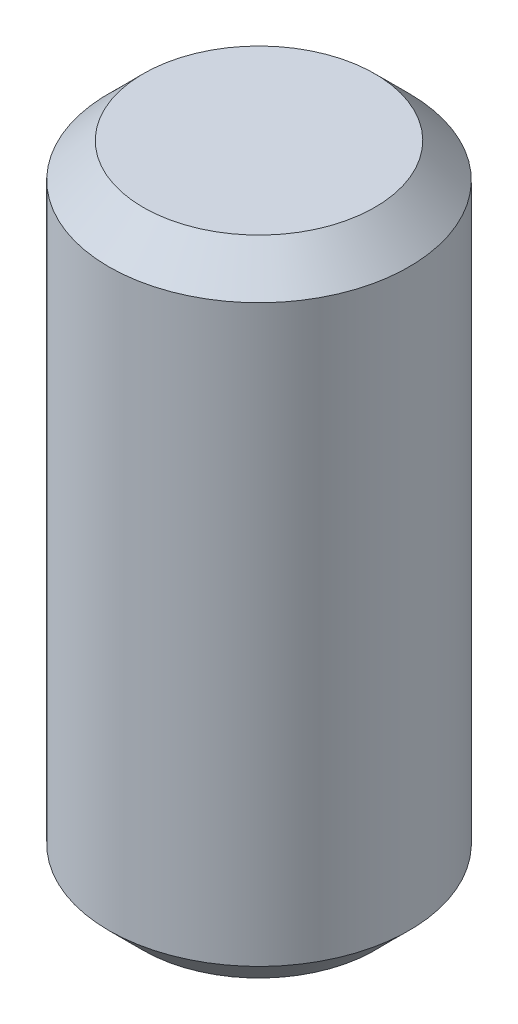
ISO-10303-21;
HEADER;
FILE_DESCRIPTION(('STEP AP214'),'2;1');
FILE_NAME('part.step','',(''),(''),'','','');
FILE_SCHEMA(('AUTOMOTIVE_DESIGN { 1 0 10303 214 1 1 1 1 }'));
ENDSEC;
DATA;
#1=APPLICATION_CONTEXT('core data for automotive mechanical design processes');
#2=APPLICATION_PROTOCOL_DEFINITION('international standard','automotive_design',2000,#1);
#3=PRODUCT_CONTEXT('',#1,'mechanical');
#4=PRODUCT('Part','Part','',(#3));
#5=PRODUCT_RELATED_PRODUCT_CATEGORY('part','',(#4));
#6=PRODUCT_DEFINITION_FORMATION('','',#4);
#7=PRODUCT_DEFINITION_CONTEXT('part definition',#1,'design');
#8=PRODUCT_DEFINITION('design','',#6,#7);
#9=PRODUCT_DEFINITION_SHAPE('','',#8);
#10=(LENGTH_UNIT() NAMED_UNIT(*) SI_UNIT(.MILLI.,.METRE.));
#11=(NAMED_UNIT(*) PLANE_ANGLE_UNIT() SI_UNIT($,.RADIAN.));
#12=(NAMED_UNIT(*) SI_UNIT($,.STERADIAN.) SOLID_ANGLE_UNIT());
#13=UNCERTAINTY_MEASURE_WITH_UNIT(LENGTH_MEASURE(1.E-05),#10,'distance_accuracy_value','');
#14=(GEOMETRIC_REPRESENTATION_CONTEXT(3) GLOBAL_UNCERTAINTY_ASSIGNED_CONTEXT((#13)) GLOBAL_UNIT_ASSIGNED_CONTEXT((#10,
#11,#12)) REPRESENTATION_CONTEXT('',''));
#15=CARTESIAN_POINT('',(0.,0.,0.));
#16=DIRECTION('',(0.,0.,1.));
#17=DIRECTION('',(1.,0.,0.));
#18=AXIS2_PLACEMENT_3D('',#15,#16,#17);
#19=CARTESIAN_POINT('',(0.,15.,0.));
#20=DIRECTION('',(0.,-1.,0.));
#21=DIRECTION('',(0.,0.,-1.));
#22=AXIS2_PLACEMENT_3D('',#19,#20,#21);
#23=CYLINDRICAL_SURFACE('',#22,3.5);
#24=CARTESIAN_POINT('',(0.,0.800000000000002,0.));
#25=DIRECTION('',(0.,1.,0.));
#26=DIRECTION('',(0.,0.,1.));
#27=AXIS2_PLACEMENT_3D('',#24,#25,#26);
#28=CIRCLE('',#27,3.5);
#29=CARTESIAN_POINT('',(0.,0.800000000000002,3.5));
#30=VERTEX_POINT('',#29);
#31=EDGE_CURVE('E53',#30,#30,#28,.T.);
#32=ORIENTED_EDGE('',*,*,#31,.T.);
#33=EDGE_LOOP('',(#32));
#34=FACE_BOUND('',#33,.T.);
#35=CARTESIAN_POINT('',(0.,14.2,0.));
#36=DIRECTION('',(0.,1.,0.));
#37=DIRECTION('',(0.,0.,1.));
#38=AXIS2_PLACEMENT_3D('',#35,#36,#37);
#39=CIRCLE('',#38,3.5);
#40=CARTESIAN_POINT('',(0.,14.2,3.5));
#41=VERTEX_POINT('',#40);
#42=EDGE_CURVE('E57',#41,#41,#39,.F.);
#43=ORIENTED_EDGE('',*,*,#42,.T.);
#44=EDGE_LOOP('',(#43));
#45=FACE_BOUND('',#44,.T.);
#46=ADVANCED_FACE('F41',(#34,#45),#23,.T.);
#47=CARTESIAN_POINT('',(0.,15.,0.));
#48=DIRECTION('',(0.,1.,0.));
#49=DIRECTION('',(0.,0.,1.));
#50=AXIS2_PLACEMENT_3D('',#47,#48,#49);
#51=PLANE('',#50);
#52=CARTESIAN_POINT('',(0.,15.,0.));
#53=DIRECTION('',(0.,1.,0.));
#54=DIRECTION('',(0.,0.,1.));
#55=AXIS2_PLACEMENT_3D('',#52,#53,#54);
#56=CIRCLE('',#55,2.7);
#57=CARTESIAN_POINT('',(0.,15.,2.7));
#58=VERTEX_POINT('',#57);
#59=EDGE_CURVE('E10',#58,#58,#56,.T.);
#60=ORIENTED_EDGE('',*,*,#59,.T.);
#61=EDGE_LOOP('',(#60));
#62=FACE_BOUND('',#61,.T.);
#63=ADVANCED_FACE('F73',(#62),#51,.T.);
#64=CARTESIAN_POINT('',(0.,0.,0.));
#65=DIRECTION('',(0.,1.,0.));
#66=DIRECTION('',(0.,0.,1.));
#67=AXIS2_PLACEMENT_3D('',#64,#65,#66);
#68=PLANE('',#67);
#69=CARTESIAN_POINT('',(0.,0.,0.));
#70=DIRECTION('',(0.,1.,0.));
#71=DIRECTION('',(0.,0.,1.));
#72=AXIS2_PLACEMENT_3D('',#69,#70,#71);
#73=CIRCLE('',#72,2.7);
#74=CARTESIAN_POINT('',(0.,0.,2.7));
#75=VERTEX_POINT('',#74);
#76=EDGE_CURVE('E49',#75,#75,#73,.F.);
#77=ORIENTED_EDGE('',*,*,#76,.T.);
#78=EDGE_LOOP('',(#77));
#79=FACE_BOUND('',#78,.T.);
#80=ADVANCED_FACE('F70',(#79),#68,.F.);
#81=CARTESIAN_POINT('',(0.,0.800000000000002,0.));
#82=DIRECTION('',(0.,1.,0.));
#83=DIRECTION('',(0.,0.,1.));
#84=AXIS2_PLACEMENT_3D('',#81,#82,#83);
#85=CONICAL_SURFACE('',#84,3.5,0.785398163397448);
#86=ORIENTED_EDGE('',*,*,#76,.F.);
#87=EDGE_LOOP('',(#86));
#88=FACE_BOUND('',#87,.T.);
#89=ORIENTED_EDGE('',*,*,#31,.F.);
#90=EDGE_LOOP('',(#89));
#91=FACE_BOUND('',#90,.T.);
#92=ADVANCED_FACE('F66',(#88,#91),#85,.T.);
#93=CARTESIAN_POINT('',(0.,15.,0.));
#94=DIRECTION('',(0.,-1.,0.));
#95=DIRECTION('',(0.,0.,-1.));
#96=AXIS2_PLACEMENT_3D('',#93,#94,#95);
#97=CONICAL_SURFACE('',#96,2.7,0.78539816339745);
#98=ORIENTED_EDGE('',*,*,#42,.F.);
#99=EDGE_LOOP('',(#98));
#100=FACE_BOUND('',#99,.T.);
#101=ORIENTED_EDGE('',*,*,#59,.F.);
#102=EDGE_LOOP('',(#101));
#103=FACE_BOUND('',#102,.T.);
#104=ADVANCED_FACE('F44',(#100,#103),#97,.T.);
#105=CLOSED_SHELL('',(#46,#63,#80,#92,#104));
#106=MANIFOLD_SOLID_BREP('B2',#105);
#107=ADVANCED_BREP_SHAPE_REPRESENTATION('',(#18,#106),#14);
#108=SHAPE_DEFINITION_REPRESENTATION(#9,#107);
ENDSEC;
END-ISO-10303-21;
